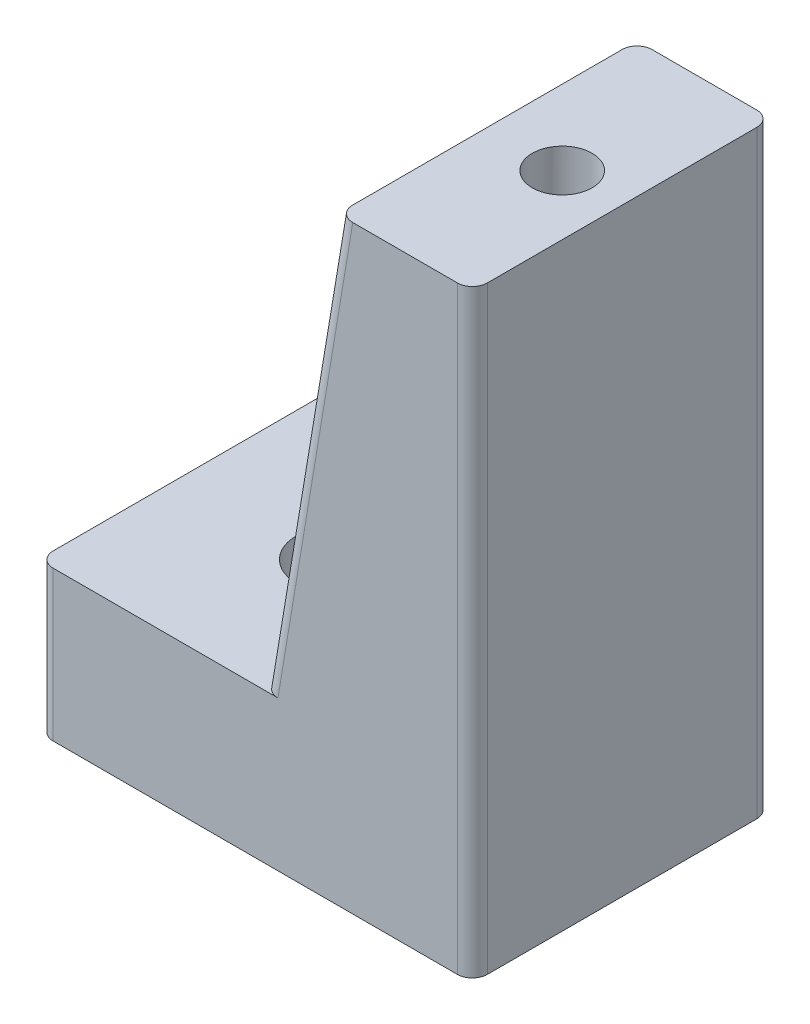
ISO-10303-21;
HEADER;
FILE_DESCRIPTION(('STEP AP214'),'2;1');
FILE_NAME('part.step','',(''),(''),'','','');
FILE_SCHEMA(('AUTOMOTIVE_DESIGN { 1 0 10303 214 1 1 1 1 }'));
ENDSEC;
DATA;
#1=APPLICATION_CONTEXT('core data for automotive mechanical design processes');
#2=APPLICATION_PROTOCOL_DEFINITION('international standard','automotive_design',2000,#1);
#3=PRODUCT_CONTEXT('',#1,'mechanical');
#4=PRODUCT('Part','Part','',(#3));
#5=PRODUCT_RELATED_PRODUCT_CATEGORY('part','',(#4));
#6=PRODUCT_DEFINITION_FORMATION('','',#4);
#7=PRODUCT_DEFINITION_CONTEXT('part definition',#1,'design');
#8=PRODUCT_DEFINITION('design','',#6,#7);
#9=PRODUCT_DEFINITION_SHAPE('','',#8);
#10=(LENGTH_UNIT() NAMED_UNIT(*) SI_UNIT(.MILLI.,.METRE.));
#11=(NAMED_UNIT(*) PLANE_ANGLE_UNIT() SI_UNIT($,.RADIAN.));
#12=(NAMED_UNIT(*) SI_UNIT($,.STERADIAN.) SOLID_ANGLE_UNIT());
#13=UNCERTAINTY_MEASURE_WITH_UNIT(LENGTH_MEASURE(1.E-05),#10,'distance_accuracy_value','');
#14=(GEOMETRIC_REPRESENTATION_CONTEXT(3) GLOBAL_UNCERTAINTY_ASSIGNED_CONTEXT((#13)) GLOBAL_UNIT_ASSIGNED_CONTEXT((#10,
#11,#12)) REPRESENTATION_CONTEXT('',''));
#15=CARTESIAN_POINT('',(0.,0.,0.));
#16=DIRECTION('',(0.,0.,1.));
#17=DIRECTION('',(1.,0.,0.));
#18=AXIS2_PLACEMENT_3D('',#15,#16,#17);
#19=CARTESIAN_POINT('',(20.,-10.,10.));
#20=DIRECTION('',(0.,1.,0.));
#21=DIRECTION('',(0.,0.,1.));
#22=AXIS2_PLACEMENT_3D('',#19,#20,#21);
#23=CYLINDRICAL_SURFACE('',#22,2.);
#24=CARTESIAN_POINT('',(20.,30.,10.));
#25=DIRECTION('',(0.,1.,0.));
#26=DIRECTION('',(0.,0.,1.));
#27=AXIS2_PLACEMENT_3D('',#24,#25,#26);
#28=CIRCLE('',#27,2.);
#29=CARTESIAN_POINT('',(20.,30.,12.));
#30=VERTEX_POINT('',#29);
#31=EDGE_CURVE('E220',#30,#30,#28,.T.);
#32=ORIENTED_EDGE('',*,*,#31,.T.);
#33=EDGE_LOOP('',(#32));
#34=FACE_BOUND('',#33,.T.);
#35=CARTESIAN_POINT('',(20.,25.,10.));
#36=DIRECTION('',(0.,-1.,0.));
#37=DIRECTION('',(1.,0.,0.));
#38=AXIS2_PLACEMENT_3D('',#35,#36,#37);
#39=CIRCLE('',#38,2.);
#40=CARTESIAN_POINT('',(22.,25.,10.));
#41=VERTEX_POINT('',#40);
#42=EDGE_CURVE('E145',#41,#41,#39,.F.);
#43=ORIENTED_EDGE('',*,*,#42,.F.);
#44=EDGE_LOOP('',(#43));
#45=FACE_BOUND('',#44,.T.);
#46=ADVANCED_FACE('F33',(#34,#45),#23,.F.);
#47=CARTESIAN_POINT('',(24.,-10.,20.));
#48=DIRECTION('',(0.,1.,0.));
#49=DIRECTION('',(-1.,0.,0.));
#50=AXIS2_PLACEMENT_3D('',#47,#48,#49);
#51=PLANE('',#50);
#52=CARTESIAN_POINT('',(5.,-10.,10.));
#53=DIRECTION('',(0.,1.,0.));
#54=DIRECTION('',(0.,0.,1.));
#55=AXIS2_PLACEMENT_3D('',#52,#53,#54);
#56=CIRCLE('',#55,2.75);
#57=CARTESIAN_POINT('',(5.,-10.,12.75));
#58=VERTEX_POINT('',#57);
#59=EDGE_CURVE('E224',#58,#58,#56,.T.);
#60=ORIENTED_EDGE('',*,*,#59,.T.);
#61=EDGE_LOOP('',(#60));
#62=FACE_BOUND('',#61,.T.);
#63=DIRECTION('',(1.,0.,0.));
#64=VECTOR('',#63,1.);
#65=CARTESIAN_POINT('',(24.,-10.,0.));
#66=LINE('',#65,#64);
#67=CARTESIAN_POINT('',(-4.,-10.,0.));
#68=VERTEX_POINT('',#67);
#69=CARTESIAN_POINT('',(23.,-10.,0.));
#70=VERTEX_POINT('',#69);
#71=EDGE_CURVE('E206',#68,#70,#66,.T.);
#72=ORIENTED_EDGE('',*,*,#71,.T.);
#73=CARTESIAN_POINT('',(23.,-9.99999999999999,1.));
#74=DIRECTION('',(0.,1.,0.));
#75=DIRECTION('',(-1.,0.,0.));
#76=AXIS2_PLACEMENT_3D('',#73,#74,#75);
#77=CIRCLE('',#76,1.);
#78=CARTESIAN_POINT('',(24.,-10.,1.));
#79=VERTEX_POINT('',#78);
#80=EDGE_CURVE('E185',#70,#79,#77,.F.);
#81=ORIENTED_EDGE('',*,*,#80,.T.);
#82=DIRECTION('',(0.,0.,-1.));
#83=VECTOR('',#82,1.);
#84=CARTESIAN_POINT('',(24.,-10.,20.));
#85=LINE('',#84,#83);
#86=CARTESIAN_POINT('',(24.,-10.,19.));
#87=VERTEX_POINT('',#86);
#88=EDGE_CURVE('E150',#87,#79,#85,.T.);
#89=ORIENTED_EDGE('',*,*,#88,.F.);
#90=CARTESIAN_POINT('',(23.,-10.,19.));
#91=DIRECTION('',(0.,1.,0.));
#92=DIRECTION('',(-1.,0.,0.));
#93=AXIS2_PLACEMENT_3D('',#90,#91,#92);
#94=CIRCLE('',#93,1.);
#95=CARTESIAN_POINT('',(23.,-10.,20.));
#96=VERTEX_POINT('',#95);
#97=EDGE_CURVE('E183',#87,#96,#94,.F.);
#98=ORIENTED_EDGE('',*,*,#97,.T.);
#99=DIRECTION('',(1.,0.,0.));
#100=VECTOR('',#99,1.);
#101=CARTESIAN_POINT('',(24.,-10.,20.));
#102=LINE('',#101,#100);
#103=CARTESIAN_POINT('',(-4.,-10.,20.));
#104=VERTEX_POINT('',#103);
#105=EDGE_CURVE('E208',#104,#96,#102,.T.);
#106=ORIENTED_EDGE('',*,*,#105,.F.);
#107=CARTESIAN_POINT('',(-4.,-10.,19.));
#108=DIRECTION('',(0.,1.,0.));
#109=DIRECTION('',(-1.,0.,0.));
#110=AXIS2_PLACEMENT_3D('',#107,#108,#109);
#111=CIRCLE('',#110,1.);
#112=CARTESIAN_POINT('',(-5.,-10.,19.));
#113=VERTEX_POINT('',#112);
#114=EDGE_CURVE('E181',#104,#113,#111,.F.);
#115=ORIENTED_EDGE('',*,*,#114,.T.);
#116=DIRECTION('',(0.,0.,-1.));
#117=VECTOR('',#116,1.);
#118=CARTESIAN_POINT('',(-5.,-10.,0.));
#119=LINE('',#118,#117);
#120=CARTESIAN_POINT('',(-5.,-10.,1.));
#121=VERTEX_POINT('',#120);
#122=EDGE_CURVE('E229',#113,#121,#119,.T.);
#123=ORIENTED_EDGE('',*,*,#122,.T.);
#124=CARTESIAN_POINT('',(-4.,-10.,1.));
#125=DIRECTION('',(0.,1.,0.));
#126=DIRECTION('',(-1.,0.,0.));
#127=AXIS2_PLACEMENT_3D('',#124,#125,#126);
#128=CIRCLE('',#127,1.);
#129=EDGE_CURVE('E179',#121,#68,#128,.F.);
#130=ORIENTED_EDGE('',*,*,#129,.T.);
#131=EDGE_LOOP('',(#72,#81,#89,#98,#106,#115,#123,#130));
#132=FACE_BOUND('',#131,.T.);
#133=ADVANCED_FACE('F247',(#62,#132),#51,.F.);
#134=CARTESIAN_POINT('',(24.,30.,20.));
#135=DIRECTION('',(-1.,0.,0.));
#136=DIRECTION('',(0.,-1.,0.));
#137=AXIS2_PLACEMENT_3D('',#134,#135,#136);
#138=PLANE('',#137);
#139=ORIENTED_EDGE('',*,*,#88,.T.);
#140=DIRECTION('',(0.,1.,0.));
#141=VECTOR('',#140,1.);
#142=CARTESIAN_POINT('',(24.,30.,1.));
#143=LINE('',#142,#141);
#144=CARTESIAN_POINT('',(24.,30.,1.));
#145=VERTEX_POINT('',#144);
#146=EDGE_CURVE('E176',#79,#145,#143,.T.);
#147=ORIENTED_EDGE('',*,*,#146,.T.);
#148=DIRECTION('',(0.,0.,-1.));
#149=VECTOR('',#148,1.);
#150=CARTESIAN_POINT('',(24.,30.,20.));
#151=LINE('',#150,#149);
#152=CARTESIAN_POINT('',(24.,30.,19.));
#153=VERTEX_POINT('',#152);
#154=EDGE_CURVE('E216',#153,#145,#151,.T.);
#155=ORIENTED_EDGE('',*,*,#154,.F.);
#156=DIRECTION('',(0.,1.,0.));
#157=VECTOR('',#156,1.);
#158=CARTESIAN_POINT('',(24.,30.,19.));
#159=LINE('',#158,#157);
#160=EDGE_CURVE('E174',#153,#87,#159,.F.);
#161=ORIENTED_EDGE('',*,*,#160,.T.);
#162=EDGE_LOOP('',(#139,#147,#155,#161));
#163=FACE_BOUND('',#162,.T.);
#164=ADVANCED_FACE('F262',(#163),#138,.F.);
#165=CARTESIAN_POINT('',(15.,30.,20.));
#166=DIRECTION('',(0.,-1.,0.));
#167=DIRECTION('',(0.,0.,-1.));
#168=AXIS2_PLACEMENT_3D('',#165,#166,#167);
#169=PLANE('',#168);
#170=ORIENTED_EDGE('',*,*,#31,.F.);
#171=EDGE_LOOP('',(#170));
#172=FACE_BOUND('',#171,.T.);
#173=DIRECTION('',(-1.,0.,0.));
#174=VECTOR('',#173,1.);
#175=CARTESIAN_POINT('',(15.,30.,0.));
#176=LINE('',#175,#174);
#177=CARTESIAN_POINT('',(23.,30.,0.));
#178=VERTEX_POINT('',#177);
#179=CARTESIAN_POINT('',(16.0137937550497,30.,0.));
#180=VERTEX_POINT('',#179);
#181=EDGE_CURVE('E201',#178,#180,#176,.T.);
#182=ORIENTED_EDGE('',*,*,#181,.T.);
#183=CARTESIAN_POINT('',(16.0137937550497,30.,1.));
#184=DIRECTION('',(0.,-1.,0.));
#185=DIRECTION('',(1.,0.,0.));
#186=AXIS2_PLACEMENT_3D('',#183,#184,#185);
#187=ELLIPSE('',#186,1.0137937550497,1.);
#188=CARTESIAN_POINT('',(15.,30.,1.));
#189=VERTEX_POINT('',#188);
#190=EDGE_CURVE('E165',#180,#189,#187,.F.);
#191=ORIENTED_EDGE('',*,*,#190,.T.);
#192=DIRECTION('',(0.,0.,-1.));
#193=VECTOR('',#192,1.);
#194=CARTESIAN_POINT('',(15.,30.,20.));
#195=LINE('',#194,#193);
#196=CARTESIAN_POINT('',(15.,30.,19.));
#197=VERTEX_POINT('',#196);
#198=EDGE_CURVE('E140',#197,#189,#195,.T.);
#199=ORIENTED_EDGE('',*,*,#198,.F.);
#200=CARTESIAN_POINT('',(16.0137937550497,30.,19.));
#201=DIRECTION('',(0.,-1.,0.));
#202=DIRECTION('',(-1.,0.,0.));
#203=AXIS2_PLACEMENT_3D('',#200,#201,#202);
#204=ELLIPSE('',#203,1.0137937550497,1.);
#205=CARTESIAN_POINT('',(16.0137937550497,30.,20.));
#206=VERTEX_POINT('',#205);
#207=EDGE_CURVE('E144',#197,#206,#204,.F.);
#208=ORIENTED_EDGE('',*,*,#207,.T.);
#209=DIRECTION('',(-1.,0.,0.));
#210=VECTOR('',#209,1.);
#211=CARTESIAN_POINT('',(15.,30.,20.));
#212=LINE('',#211,#210);
#213=CARTESIAN_POINT('',(23.,30.,20.));
#214=VERTEX_POINT('',#213);
#215=EDGE_CURVE('E237',#214,#206,#212,.T.);
#216=ORIENTED_EDGE('',*,*,#215,.F.);
#217=CARTESIAN_POINT('',(23.,30.,19.));
#218=DIRECTION('',(0.,-1.,0.));
#219=DIRECTION('',(0.,0.,-1.));
#220=AXIS2_PLACEMENT_3D('',#217,#218,#219);
#221=CIRCLE('',#220,1.);
#222=EDGE_CURVE('E160',#214,#153,#221,.F.);
#223=ORIENTED_EDGE('',*,*,#222,.T.);
#224=ORIENTED_EDGE('',*,*,#154,.T.);
#225=CARTESIAN_POINT('',(23.,30.,1.));
#226=DIRECTION('',(0.,-1.,0.));
#227=DIRECTION('',(0.,0.,-1.));
#228=AXIS2_PLACEMENT_3D('',#225,#226,#227);
#229=CIRCLE('',#228,1.);
#230=EDGE_CURVE('E162',#145,#178,#229,.F.);
#231=ORIENTED_EDGE('',*,*,#230,.T.);
#232=EDGE_LOOP('',(#182,#191,#199,#208,#216,#223,#224,#231));
#233=FACE_BOUND('',#232,.T.);
#234=ADVANCED_FACE('F204',(#172,#233),#169,.F.);
#235=CARTESIAN_POINT('',(10.,0.,20.));
#236=DIRECTION('',(0.986393923832144,-0.164398987305357,0.));
#237=DIRECTION('',(0.164398987305357,0.986393923832144,0.));
#238=AXIS2_PLACEMENT_3D('',#235,#236,#237);
#239=PLANE('',#238);
#240=ORIENTED_EDGE('',*,*,#198,.T.);
#241=DIRECTION('',(-0.164398987305357,-0.986393923832144,0.));
#242=VECTOR('',#241,1.);
#243=CARTESIAN_POINT('',(10.,0.,1.));
#244=LINE('',#243,#242);
#245=CARTESIAN_POINT('',(10.,0.,1.));
#246=VERTEX_POINT('',#245);
#247=EDGE_CURVE('E139',#189,#246,#244,.T.);
#248=ORIENTED_EDGE('',*,*,#247,.T.);
#249=DIRECTION('',(0.,0.,-1.));
#250=VECTOR('',#249,1.);
#251=CARTESIAN_POINT('',(10.,0.,20.));
#252=LINE('',#251,#250);
#253=CARTESIAN_POINT('',(10.,0.,19.));
#254=VERTEX_POINT('',#253);
#255=EDGE_CURVE('E125',#254,#246,#252,.T.);
#256=ORIENTED_EDGE('',*,*,#255,.F.);
#257=DIRECTION('',(-0.164398987305357,-0.986393923832144,0.));
#258=VECTOR('',#257,1.);
#259=CARTESIAN_POINT('',(10.,0.,19.));
#260=LINE('',#259,#258);
#261=EDGE_CURVE('E136',#254,#197,#260,.F.);
#262=ORIENTED_EDGE('',*,*,#261,.T.);
#263=EDGE_LOOP('',(#240,#248,#256,#262));
#264=FACE_BOUND('',#263,.T.);
#265=ADVANCED_FACE('F135',(#264),#239,.F.);
#266=CARTESIAN_POINT('',(0.,0.,20.));
#267=DIRECTION('',(0.,-1.,0.));
#268=DIRECTION('',(0.,0.,-1.));
#269=AXIS2_PLACEMENT_3D('',#266,#267,#268);
#270=PLANE('',#269);
#271=CARTESIAN_POINT('',(5.,0.,10.));
#272=DIRECTION('',(0.,-1.,0.));
#273=DIRECTION('',(0.,0.,-1.));
#274=AXIS2_PLACEMENT_3D('',#271,#272,#273);
#275=CIRCLE('',#274,2.75);
#276=CARTESIAN_POINT('',(5.,0.,7.25));
#277=VERTEX_POINT('',#276);
#278=EDGE_CURVE('E211',#277,#277,#275,.T.);
#279=ORIENTED_EDGE('',*,*,#278,.T.);
#280=EDGE_LOOP('',(#279));
#281=FACE_BOUND('',#280,.T.);
#282=DIRECTION('',(0.,0.,1.));
#283=VECTOR('',#282,1.);
#284=CARTESIAN_POINT('',(-5.,0.,0.));
#285=LINE('',#284,#283);
#286=CARTESIAN_POINT('',(-5.,0.,1.));
#287=VERTEX_POINT('',#286);
#288=CARTESIAN_POINT('',(-5.,0.,19.));
#289=VERTEX_POINT('',#288);
#290=EDGE_CURVE('E232',#287,#289,#285,.T.);
#291=ORIENTED_EDGE('',*,*,#290,.T.);
#292=CARTESIAN_POINT('',(-4.,0.,19.));
#293=DIRECTION('',(0.,-1.,0.));
#294=DIRECTION('',(0.,0.,-1.));
#295=AXIS2_PLACEMENT_3D('',#292,#293,#294);
#296=CIRCLE('',#295,1.);
#297=CARTESIAN_POINT('',(-4.,0.,20.));
#298=VERTEX_POINT('',#297);
#299=EDGE_CURVE('E48',#289,#298,#296,.F.);
#300=ORIENTED_EDGE('',*,*,#299,.T.);
#301=DIRECTION('',(-1.,0.,0.));
#302=VECTOR('',#301,1.);
#303=CARTESIAN_POINT('',(0.,0.,20.));
#304=LINE('',#303,#302);
#305=CARTESIAN_POINT('',(11.0137937550497,0.,20.));
#306=VERTEX_POINT('',#305);
#307=EDGE_CURVE('E127',#306,#298,#304,.T.);
#308=ORIENTED_EDGE('',*,*,#307,.F.);
#309=CARTESIAN_POINT('',(11.0137937550497,0.,19.));
#310=DIRECTION('',(0.,-1.,0.));
#311=DIRECTION('',(-1.,0.,0.));
#312=AXIS2_PLACEMENT_3D('',#309,#310,#311);
#313=ELLIPSE('',#312,1.0137937550497,1.);
#314=EDGE_CURVE('E11',#306,#254,#313,.T.);
#315=ORIENTED_EDGE('',*,*,#314,.T.);
#316=ORIENTED_EDGE('',*,*,#255,.T.);
#317=CARTESIAN_POINT('',(11.0137937550497,0.,1.));
#318=DIRECTION('',(0.,-1.,0.));
#319=DIRECTION('',(1.,0.,0.));
#320=AXIS2_PLACEMENT_3D('',#317,#318,#319);
#321=ELLIPSE('',#320,1.0137937550497,1.);
#322=CARTESIAN_POINT('',(11.0137937550497,0.,0.));
#323=VERTEX_POINT('',#322);
#324=EDGE_CURVE('E41',#246,#323,#321,.T.);
#325=ORIENTED_EDGE('',*,*,#324,.T.);
#326=DIRECTION('',(-1.,0.,0.));
#327=VECTOR('',#326,1.);
#328=CARTESIAN_POINT('',(0.,0.,0.));
#329=LINE('',#328,#327);
#330=CARTESIAN_POINT('',(-4.,0.,0.));
#331=VERTEX_POINT('',#330);
#332=EDGE_CURVE('E193',#323,#331,#329,.T.);
#333=ORIENTED_EDGE('',*,*,#332,.T.);
#334=CARTESIAN_POINT('',(-4.,0.,1.));
#335=DIRECTION('',(0.,-1.,0.));
#336=DIRECTION('',(0.,0.,-1.));
#337=AXIS2_PLACEMENT_3D('',#334,#335,#336);
#338=CIRCLE('',#337,1.);
#339=EDGE_CURVE('E56',#331,#287,#338,.F.);
#340=ORIENTED_EDGE('',*,*,#339,.T.);
#341=EDGE_LOOP('',(#291,#300,#308,#315,#316,#325,#333,#340));
#342=FACE_BOUND('',#341,.T.);
#343=ADVANCED_FACE('F123',(#281,#342),#270,.F.);
#344=CARTESIAN_POINT('',(0.,0.,20.));
#345=DIRECTION('',(0.,0.,-1.));
#346=DIRECTION('',(-1.,0.,0.));
#347=AXIS2_PLACEMENT_3D('',#344,#345,#346);
#348=PLANE('',#347);
#349=ORIENTED_EDGE('',*,*,#215,.T.);
#350=DIRECTION('',(-0.164398987305357,-0.986393923832144,0.));
#351=VECTOR('',#350,1.);
#352=CARTESIAN_POINT('',(10.7161236535619,-1.78602060892698,20.));
#353=LINE('',#352,#351);
#354=EDGE_CURVE('E172',#206,#306,#353,.T.);
#355=ORIENTED_EDGE('',*,*,#354,.T.);
#356=ORIENTED_EDGE('',*,*,#307,.T.);
#357=DIRECTION('',(0.,1.,0.));
#358=VECTOR('',#357,1.);
#359=CARTESIAN_POINT('',(-4.,-10.,20.));
#360=LINE('',#359,#358);
#361=EDGE_CURVE('E167',#298,#104,#360,.F.);
#362=ORIENTED_EDGE('',*,*,#361,.T.);
#363=ORIENTED_EDGE('',*,*,#105,.T.);
#364=DIRECTION('',(0.,1.,0.));
#365=VECTOR('',#364,1.);
#366=CARTESIAN_POINT('',(23.,0.,20.));
#367=LINE('',#366,#365);
#368=EDGE_CURVE('E169',#96,#214,#367,.T.);
#369=ORIENTED_EDGE('',*,*,#368,.T.);
#370=EDGE_LOOP('',(#349,#355,#356,#362,#363,#369));
#371=FACE_BOUND('',#370,.T.);
#372=ADVANCED_FACE('F240',(#371),#348,.F.);
#373=CARTESIAN_POINT('',(0.,0.,0.));
#374=DIRECTION('',(0.,0.,-1.));
#375=DIRECTION('',(-1.,0.,0.));
#376=AXIS2_PLACEMENT_3D('',#373,#374,#375);
#377=PLANE('',#376);
#378=ORIENTED_EDGE('',*,*,#332,.F.);
#379=DIRECTION('',(-0.164398987305357,-0.986393923832144,0.));
#380=VECTOR('',#379,1.);
#381=CARTESIAN_POINT('',(15.9863939238321,29.8356010126946,0.));
#382=LINE('',#381,#380);
#383=EDGE_CURVE('E158',#323,#180,#382,.F.);
#384=ORIENTED_EDGE('',*,*,#383,.T.);
#385=ORIENTED_EDGE('',*,*,#181,.F.);
#386=DIRECTION('',(0.,1.,0.));
#387=VECTOR('',#386,1.);
#388=CARTESIAN_POINT('',(23.,-9.99999999999999,0.));
#389=LINE('',#388,#387);
#390=EDGE_CURVE('E156',#178,#70,#389,.F.);
#391=ORIENTED_EDGE('',*,*,#390,.T.);
#392=ORIENTED_EDGE('',*,*,#71,.F.);
#393=DIRECTION('',(0.,1.,0.));
#394=VECTOR('',#393,1.);
#395=CARTESIAN_POINT('',(-4.,0.,0.));
#396=LINE('',#395,#394);
#397=EDGE_CURVE('E147',#68,#331,#396,.T.);
#398=ORIENTED_EDGE('',*,*,#397,.T.);
#399=EDGE_LOOP('',(#378,#384,#385,#391,#392,#398));
#400=FACE_BOUND('',#399,.T.);
#401=ADVANCED_FACE('F200',(#400),#377,.T.);
#402=CARTESIAN_POINT('',(5.,-10.,10.));
#403=DIRECTION('',(0.,1.,0.));
#404=DIRECTION('',(0.,0.,1.));
#405=AXIS2_PLACEMENT_3D('',#402,#403,#404);
#406=CYLINDRICAL_SURFACE('',#405,2.75);
#407=ORIENTED_EDGE('',*,*,#59,.F.);
#408=EDGE_LOOP('',(#407));
#409=FACE_BOUND('',#408,.T.);
#410=ORIENTED_EDGE('',*,*,#278,.F.);
#411=EDGE_LOOP('',(#410));
#412=FACE_BOUND('',#411,.T.);
#413=ADVANCED_FACE('F288',(#409,#412),#406,.F.);
#414=CARTESIAN_POINT('',(20.,25.,10.));
#415=DIRECTION('',(0.,-1.,0.));
#416=DIRECTION('',(1.,0.,0.));
#417=AXIS2_PLACEMENT_3D('',#414,#415,#416);
#418=PLANE('',#417);
#419=ORIENTED_EDGE('',*,*,#42,.T.);
#420=EDGE_LOOP('',(#419));
#421=FACE_BOUND('',#420,.T.);
#422=ADVANCED_FACE('F286',(#421),#418,.F.);
#423=CARTESIAN_POINT('',(-5.,-30.6155281280883,0.));
#424=DIRECTION('',(-1.,0.,0.));
#425=DIRECTION('',(0.,0.,1.));
#426=AXIS2_PLACEMENT_3D('',#423,#424,#425);
#427=PLANE('',#426);
#428=ORIENTED_EDGE('',*,*,#122,.F.);
#429=DIRECTION('',(0.,1.,0.));
#430=VECTOR('',#429,1.);
#431=CARTESIAN_POINT('',(-5.,0.,19.));
#432=LINE('',#431,#430);
#433=EDGE_CURVE('E189',#113,#289,#432,.T.);
#434=ORIENTED_EDGE('',*,*,#433,.T.);
#435=ORIENTED_EDGE('',*,*,#290,.F.);
#436=DIRECTION('',(0.,1.,0.));
#437=VECTOR('',#436,1.);
#438=CARTESIAN_POINT('',(-5.,-30.6155281280883,1.));
#439=LINE('',#438,#437);
#440=EDGE_CURVE('E187',#287,#121,#439,.F.);
#441=ORIENTED_EDGE('',*,*,#440,.T.);
#442=EDGE_LOOP('',(#428,#434,#435,#441));
#443=FACE_BOUND('',#442,.T.);
#444=ADVANCED_FACE('F250',(#443),#427,.T.);
#445=CARTESIAN_POINT('',(10.9863939238321,-0.164398987305357,1.));
#446=DIRECTION('',(0.164398987305357,0.986393923832144,0.));
#447=DIRECTION('',(-0.986393923832144,0.164398987305357,0.));
#448=AXIS2_PLACEMENT_3D('',#445,#446,#447);
#449=CYLINDRICAL_SURFACE('',#448,1.);
#450=ORIENTED_EDGE('',*,*,#190,.F.);
#451=ORIENTED_EDGE('',*,*,#383,.F.);
#452=ORIENTED_EDGE('',*,*,#324,.F.);
#453=ORIENTED_EDGE('',*,*,#247,.F.);
#454=EDGE_LOOP('',(#450,#451,#452,#453));
#455=FACE_BOUND('',#454,.T.);
#456=ADVANCED_FACE('F196',(#455),#449,.T.);
#457=CARTESIAN_POINT('',(10.7161236535619,-1.78602060892698,19.));
#458=DIRECTION('',(-0.164398987305357,-0.986393923832144,0.));
#459=DIRECTION('',(0.986393923832144,-0.164398987305357,0.));
#460=AXIS2_PLACEMENT_3D('',#457,#458,#459);
#461=CYLINDRICAL_SURFACE('',#460,1.);
#462=ORIENTED_EDGE('',*,*,#207,.F.);
#463=ORIENTED_EDGE('',*,*,#261,.F.);
#464=ORIENTED_EDGE('',*,*,#314,.F.);
#465=ORIENTED_EDGE('',*,*,#354,.F.);
#466=EDGE_LOOP('',(#462,#463,#464,#465));
#467=FACE_BOUND('',#466,.T.);
#468=ADVANCED_FACE('F143',(#467),#461,.T.);
#469=CARTESIAN_POINT('',(23.,30.,1.));
#470=DIRECTION('',(0.,-1.,0.));
#471=DIRECTION('',(1.,0.,0.));
#472=AXIS2_PLACEMENT_3D('',#469,#470,#471);
#473=CYLINDRICAL_SURFACE('',#472,1.);
#474=ORIENTED_EDGE('',*,*,#80,.F.);
#475=ORIENTED_EDGE('',*,*,#390,.F.);
#476=ORIENTED_EDGE('',*,*,#230,.F.);
#477=ORIENTED_EDGE('',*,*,#146,.F.);
#478=EDGE_LOOP('',(#474,#475,#476,#477));
#479=FACE_BOUND('',#478,.T.);
#480=ADVANCED_FACE('F257',(#479),#473,.T.);
#481=CARTESIAN_POINT('',(23.,0.,19.));
#482=DIRECTION('',(0.,1.,0.));
#483=DIRECTION('',(-1.,0.,0.));
#484=AXIS2_PLACEMENT_3D('',#481,#482,#483);
#485=CYLINDRICAL_SURFACE('',#484,1.);
#486=ORIENTED_EDGE('',*,*,#97,.F.);
#487=ORIENTED_EDGE('',*,*,#160,.F.);
#488=ORIENTED_EDGE('',*,*,#222,.F.);
#489=ORIENTED_EDGE('',*,*,#368,.F.);
#490=EDGE_LOOP('',(#486,#487,#488,#489));
#491=FACE_BOUND('',#490,.T.);
#492=ADVANCED_FACE('F266',(#491),#485,.T.);
#493=CARTESIAN_POINT('',(-4.,-30.6155281280883,19.));
#494=DIRECTION('',(0.,-1.,0.));
#495=DIRECTION('',(0.,0.,-1.));
#496=AXIS2_PLACEMENT_3D('',#493,#494,#495);
#497=CYLINDRICAL_SURFACE('',#496,1.);
#498=ORIENTED_EDGE('',*,*,#114,.F.);
#499=ORIENTED_EDGE('',*,*,#361,.F.);
#500=ORIENTED_EDGE('',*,*,#299,.F.);
#501=ORIENTED_EDGE('',*,*,#433,.F.);
#502=EDGE_LOOP('',(#498,#499,#500,#501));
#503=FACE_BOUND('',#502,.T.);
#504=ADVANCED_FACE('F243',(#503),#497,.T.);
#505=CARTESIAN_POINT('',(-4.,0.,1.));
#506=DIRECTION('',(0.,1.,0.));
#507=DIRECTION('',(0.,0.,1.));
#508=AXIS2_PLACEMENT_3D('',#505,#506,#507);
#509=CYLINDRICAL_SURFACE('',#508,1.);
#510=ORIENTED_EDGE('',*,*,#129,.F.);
#511=ORIENTED_EDGE('',*,*,#440,.F.);
#512=ORIENTED_EDGE('',*,*,#339,.F.);
#513=ORIENTED_EDGE('',*,*,#397,.F.);
#514=EDGE_LOOP('',(#510,#511,#512,#513));
#515=FACE_BOUND('',#514,.T.);
#516=ADVANCED_FACE('F35',(#515),#509,.T.);
#517=CLOSED_SHELL('',(#46,#133,#164,#234,#265,#343,#372,#401,#413,#422,#444,#456,#468,#480,#492,
#504,#516));
#518=MANIFOLD_SOLID_BREP('B2',#517);
#519=ADVANCED_BREP_SHAPE_REPRESENTATION('',(#18,#518),#14);
#520=SHAPE_DEFINITION_REPRESENTATION(#9,#519);
ENDSEC;
END-ISO-10303-21;
